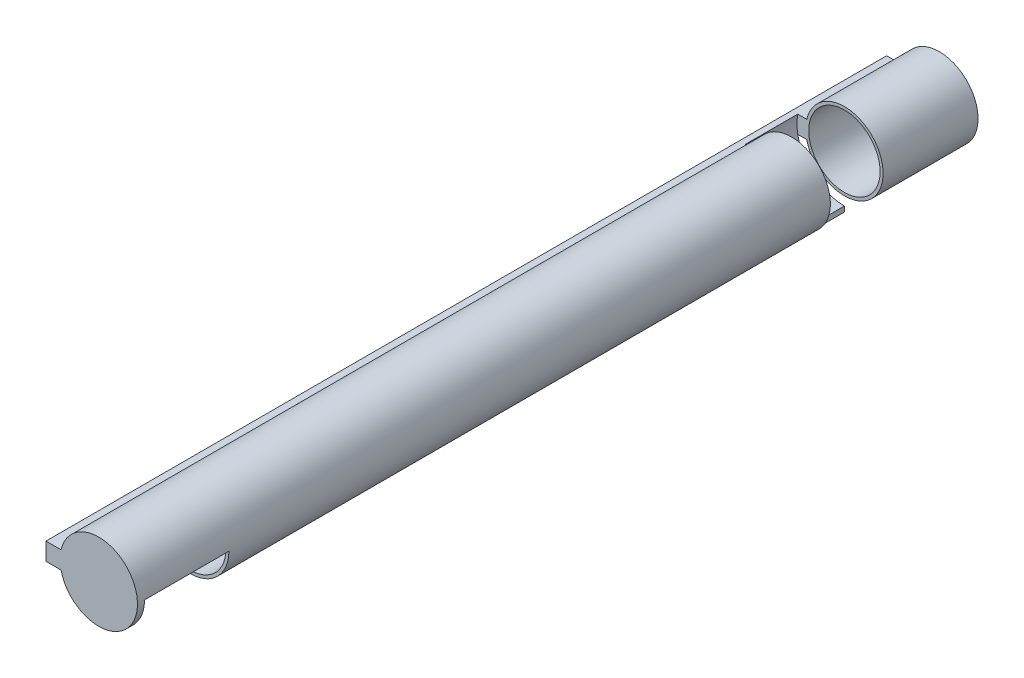
ISO-10303-21;
HEADER;
FILE_DESCRIPTION(('STEP AP214'),'2;1');
FILE_NAME('part.step','',(''),(''),'','','');
FILE_SCHEMA(('AUTOMOTIVE_DESIGN { 1 0 10303 214 1 1 1 1 }'));
ENDSEC;
DATA;
#1=APPLICATION_CONTEXT('core data for automotive mechanical design processes');
#2=APPLICATION_PROTOCOL_DEFINITION('international standard','automotive_design',2000,#1);
#3=PRODUCT_CONTEXT('',#1,'mechanical');
#4=PRODUCT('Part','Part','',(#3));
#5=PRODUCT_RELATED_PRODUCT_CATEGORY('part','',(#4));
#6=PRODUCT_DEFINITION_FORMATION('','',#4);
#7=PRODUCT_DEFINITION_CONTEXT('part definition',#1,'design');
#8=PRODUCT_DEFINITION('design','',#6,#7);
#9=PRODUCT_DEFINITION_SHAPE('','',#8);
#10=(LENGTH_UNIT() NAMED_UNIT(*) SI_UNIT(.MILLI.,.METRE.));
#11=(NAMED_UNIT(*) PLANE_ANGLE_UNIT() SI_UNIT($,.RADIAN.));
#12=(NAMED_UNIT(*) SI_UNIT($,.STERADIAN.) SOLID_ANGLE_UNIT());
#13=UNCERTAINTY_MEASURE_WITH_UNIT(LENGTH_MEASURE(1.E-05),#10,'distance_accuracy_value','');
#14=(GEOMETRIC_REPRESENTATION_CONTEXT(3) GLOBAL_UNCERTAINTY_ASSIGNED_CONTEXT((#13)) GLOBAL_UNIT_ASSIGNED_CONTEXT((#10,
#11,#12)) REPRESENTATION_CONTEXT('',''));
#15=CARTESIAN_POINT('',(0.,0.,0.));
#16=DIRECTION('',(0.,0.,1.));
#17=DIRECTION('',(1.,0.,0.));
#18=AXIS2_PLACEMENT_3D('',#15,#16,#17);
#19=CARTESIAN_POINT('',(0.,0.,213.));
#20=DIRECTION('',(0.,0.,1.));
#21=DIRECTION('',(1.,0.,0.));
#22=AXIS2_PLACEMENT_3D('',#19,#20,#21);
#23=PLANE('',#22);
#24=CARTESIAN_POINT('',(0.,0.,213.));
#25=DIRECTION('',(0.,0.,1.));
#26=DIRECTION('',(1.,0.,0.));
#27=AXIS2_PLACEMENT_3D('',#24,#25,#26);
#28=CIRCLE('',#27,10.15);
#29=CARTESIAN_POINT('',(10.15,0.,213.));
#30=VERTEX_POINT('',#29);
#31=CARTESIAN_POINT('',(0.,-10.15,213.));
#32=VERTEX_POINT('',#31);
#33=EDGE_CURVE('E162',#30,#32,#28,.T.);
#34=ORIENTED_EDGE('',*,*,#33,.T.);
#35=CARTESIAN_POINT('',(-7.71138852474491,-12.2794334975369,213.));
#36=DIRECTION('',(0.,0.,1.));
#37=DIRECTION('',(1.,0.,0.));
#38=AXIS2_PLACEMENT_3D('',#35,#36,#37);
#39=CIRCLE('',#38,8.);
#40=CARTESIAN_POINT('',(-3.45682933867876,-5.50457363682691,213.));
#41=VERTEX_POINT('',#40);
#42=EDGE_CURVE('E168',#32,#41,#39,.T.);
#43=ORIENTED_EDGE('',*,*,#42,.T.);
#44=CARTESIAN_POINT('',(0.,0.,213.));
#45=DIRECTION('',(0.,0.,1.));
#46=DIRECTION('',(1.,0.,0.));
#47=AXIS2_PLACEMENT_3D('',#44,#45,#46);
#48=CIRCLE('',#47,6.5);
#49=CARTESIAN_POINT('',(5.50457363682691,3.45682933867876,213.));
#50=VERTEX_POINT('',#49);
#51=EDGE_CURVE('E164',#50,#41,#48,.T.);
#52=ORIENTED_EDGE('',*,*,#51,.F.);
#53=CARTESIAN_POINT('',(12.2794334975369,7.71138852474491,213.));
#54=DIRECTION('',(0.,0.,1.));
#55=DIRECTION('',(1.,0.,0.));
#56=AXIS2_PLACEMENT_3D('',#53,#54,#55);
#57=CIRCLE('',#56,8.);
#58=EDGE_CURVE('E159',#50,#30,#57,.T.);
#59=ORIENTED_EDGE('',*,*,#58,.T.);
#60=EDGE_LOOP('',(#34,#43,#52,#59));
#61=FACE_BOUND('',#60,.T.);
#62=ADVANCED_FACE('F34',(#61),#23,.T.);
#63=CARTESIAN_POINT('',(0.,0.,210.));
#64=DIRECTION('',(0.,0.,-1.));
#65=DIRECTION('',(-1.,0.,0.));
#66=AXIS2_PLACEMENT_3D('',#63,#64,#65);
#67=CYLINDRICAL_SURFACE('',#66,11.);
#68=CARTESIAN_POINT('',(0.,0.,27.));
#69=DIRECTION('',(0.,0.,1.));
#70=DIRECTION('',(1.,0.,0.));
#71=AXIS2_PLACEMENT_3D('',#68,#69,#70);
#72=CIRCLE('',#71,11.);
#73=CARTESIAN_POINT('',(-10.7121426428143,-2.5,27.));
#74=VERTEX_POINT('',#73);
#75=CARTESIAN_POINT('',(-10.7121426428143,2.5,27.));
#76=VERTEX_POINT('',#75);
#77=EDGE_CURVE('E242',#74,#76,#72,.T.);
#78=ORIENTED_EDGE('',*,*,#77,.F.);
#79=DIRECTION('',(0.,0.,-1.));
#80=VECTOR('',#79,1.);
#81=CARTESIAN_POINT('',(-10.7121426428143,-2.5,245.58678379147));
#82=LINE('',#81,#80);
#83=CARTESIAN_POINT('',(-10.7121426428143,-2.5,0.));
#84=VERTEX_POINT('',#83);
#85=EDGE_CURVE('E265',#74,#84,#82,.T.);
#86=ORIENTED_EDGE('',*,*,#85,.T.);
#87=CARTESIAN_POINT('',(0.,0.,0.));
#88=DIRECTION('',(0.,0.,1.));
#89=DIRECTION('',(1.,0.,0.));
#90=AXIS2_PLACEMENT_3D('',#87,#88,#89);
#91=CIRCLE('',#90,11.);
#92=CARTESIAN_POINT('',(-10.7121426428143,2.5,0.));
#93=VERTEX_POINT('',#92);
#94=EDGE_CURVE('E193',#84,#93,#91,.T.);
#95=ORIENTED_EDGE('',*,*,#94,.T.);
#96=DIRECTION('',(0.,0.,-1.));
#97=VECTOR('',#96,1.);
#98=CARTESIAN_POINT('',(-10.7121426428143,2.5,245.58678379147));
#99=LINE('',#98,#97);
#100=EDGE_CURVE('E261',#76,#93,#99,.T.);
#101=ORIENTED_EDGE('',*,*,#100,.F.);
#102=EDGE_LOOP('',(#78,#86,#95,#101));
#103=FACE_BOUND('',#102,.T.);
#104=ADVANCED_FACE('F344',(#103),#67,.T.);
#105=CARTESIAN_POINT('',(0.,0.,210.));
#106=DIRECTION('',(0.,0.,-1.));
#107=DIRECTION('',(-1.,0.,0.));
#108=AXIS2_PLACEMENT_3D('',#105,#106,#107);
#109=CYLINDRICAL_SURFACE('',#108,10.15);
#110=CARTESIAN_POINT('',(0.,0.,0.));
#111=DIRECTION('',(0.,0.,1.));
#112=DIRECTION('',(1.,0.,0.));
#113=AXIS2_PLACEMENT_3D('',#110,#111,#112);
#114=CIRCLE('',#113,10.15);
#115=CARTESIAN_POINT('',(10.15,0.,0.));
#116=VERTEX_POINT('',#115);
#117=EDGE_CURVE('E312',#116,#116,#114,.T.);
#118=ORIENTED_EDGE('',*,*,#117,.F.);
#119=EDGE_LOOP('',(#118));
#120=FACE_BOUND('',#119,.T.);
#121=CARTESIAN_POINT('',(0.,0.,27.));
#122=DIRECTION('',(0.,0.,1.));
#123=DIRECTION('',(1.,0.,0.));
#124=AXIS2_PLACEMENT_3D('',#121,#122,#123);
#125=CIRCLE('',#124,10.15);
#126=CARTESIAN_POINT('',(10.15,0.,27.));
#127=VERTEX_POINT('',#126);
#128=EDGE_CURVE('E247',#127,#127,#125,.T.);
#129=ORIENTED_EDGE('',*,*,#128,.T.);
#130=EDGE_LOOP('',(#129));
#131=FACE_BOUND('',#130,.T.);
#132=ADVANCED_FACE('F349',(#120,#131),#109,.F.);
#133=DIRECTION('',(0.,0.,-1.));
#134=VECTOR('',#133,1.);
#135=CARTESIAN_POINT('',(11.,0.,237.));
#136=LINE('',#135,#134);
#137=CARTESIAN_POINT('',(11.,0.,237.));
#138=VERTEX_POINT('',#137);
#139=CARTESIAN_POINT('',(11.,0.,213.));
#140=VERTEX_POINT('',#139);
#141=EDGE_CURVE('E208',#138,#140,#136,.T.);
#142=ORIENTED_EDGE('',*,*,#141,.T.);
#143=CARTESIAN_POINT('',(0.,0.,213.));
#144=DIRECTION('',(0.,0.,1.));
#145=DIRECTION('',(1.,0.,0.));
#146=AXIS2_PLACEMENT_3D('',#143,#144,#145);
#147=CIRCLE('',#146,11.);
#148=CARTESIAN_POINT('',(0.,-11.,213.));
#149=VERTEX_POINT('',#148);
#150=EDGE_CURVE('E188',#149,#140,#147,.T.);
#151=ORIENTED_EDGE('',*,*,#150,.F.);
#152=DIRECTION('',(0.,0.,-1.));
#153=VECTOR('',#152,1.);
#154=CARTESIAN_POINT('',(0.,-11.,237.));
#155=LINE('',#154,#153);
#156=CARTESIAN_POINT('',(0.,-11.,237.));
#157=VERTEX_POINT('',#156);
#158=EDGE_CURVE('E309',#157,#149,#155,.T.);
#159=ORIENTED_EDGE('',*,*,#158,.F.);
#160=CARTESIAN_POINT('',(0.,0.,237.));
#161=DIRECTION('',(0.,0.,1.));
#162=DIRECTION('',(1.,0.,0.));
#163=AXIS2_PLACEMENT_3D('',#160,#161,#162);
#164=CIRCLE('',#163,11.);
#165=EDGE_CURVE('E277',#157,#138,#164,.T.);
#166=ORIENTED_EDGE('',*,*,#165,.T.);
#167=EDGE_LOOP('',(#142,#151,#159,#166));
#168=FACE_BOUND('',#167,.T.);
#169=CARTESIAN_POINT('',(-10.7121426428143,-2.5,239.));
#170=VERTEX_POINT('',#169);
#171=CARTESIAN_POINT('',(-10.7121426428143,-2.5,42.));
#172=VERTEX_POINT('',#171);
#173=EDGE_CURVE('E284',#170,#172,#82,.T.);
#174=ORIENTED_EDGE('',*,*,#173,.T.);
#175=CARTESIAN_POINT('',(0.,0.,42.));
#176=DIRECTION('',(0.,0.,1.));
#177=DIRECTION('',(1.,0.,0.));
#178=AXIS2_PLACEMENT_3D('',#175,#176,#177);
#179=CIRCLE('',#178,11.);
#180=CARTESIAN_POINT('',(-10.7121426428143,2.5,42.));
#181=VERTEX_POINT('',#180);
#182=EDGE_CURVE('E250',#172,#181,#179,.T.);
#183=ORIENTED_EDGE('',*,*,#182,.T.);
#184=CARTESIAN_POINT('',(-10.7121426428143,2.5,239.));
#185=VERTEX_POINT('',#184);
#186=EDGE_CURVE('E274',#185,#181,#99,.T.);
#187=ORIENTED_EDGE('',*,*,#186,.F.);
#188=CARTESIAN_POINT('',(0.,0.,239.));
#189=DIRECTION('',(0.,0.,1.));
#190=DIRECTION('',(1.,0.,0.));
#191=AXIS2_PLACEMENT_3D('',#188,#189,#190);
#192=CIRCLE('',#191,11.);
#193=EDGE_CURVE('E291',#170,#185,#192,.T.);
#194=ORIENTED_EDGE('',*,*,#193,.F.);
#195=EDGE_LOOP('',(#174,#183,#187,#194));
#196=FACE_BOUND('',#195,.T.);
#197=ADVANCED_FACE('F351',(#168,#196),#67,.T.);
#198=CARTESIAN_POINT('',(0.,0.,42.));
#199=DIRECTION('',(0.,0.,1.));
#200=DIRECTION('',(1.,0.,0.));
#201=AXIS2_PLACEMENT_3D('',#198,#199,#200);
#202=CIRCLE('',#201,10.15);
#203=CARTESIAN_POINT('',(10.15,0.,42.));
#204=VERTEX_POINT('',#203);
#205=EDGE_CURVE('E256',#204,#204,#202,.T.);
#206=ORIENTED_EDGE('',*,*,#205,.F.);
#207=EDGE_LOOP('',(#206));
#208=FACE_BOUND('',#207,.T.);
#209=CARTESIAN_POINT('',(0.,0.,210.));
#210=DIRECTION('',(0.,0.,1.));
#211=DIRECTION('',(1.,0.,0.));
#212=AXIS2_PLACEMENT_3D('',#209,#210,#211);
#213=CIRCLE('',#212,10.15);
#214=CARTESIAN_POINT('',(10.15,0.,210.));
#215=VERTEX_POINT('',#214);
#216=CARTESIAN_POINT('',(0.,-10.15,210.));
#217=VERTEX_POINT('',#216);
#218=EDGE_CURVE('E313',#215,#217,#213,.T.);
#219=ORIENTED_EDGE('',*,*,#218,.T.);
#220=DIRECTION('',(0.,0.,-1.));
#221=VECTOR('',#220,1.);
#222=CARTESIAN_POINT('',(0.,-10.15,227.354267658087));
#223=LINE('',#222,#221);
#224=EDGE_CURVE('E181',#32,#217,#223,.T.);
#225=ORIENTED_EDGE('',*,*,#224,.F.);
#226=CARTESIAN_POINT('',(0.,0.,213.));
#227=DIRECTION('',(0.,0.,1.));
#228=DIRECTION('',(1.,0.,0.));
#229=AXIS2_PLACEMENT_3D('',#226,#227,#228);
#230=CIRCLE('',#229,10.15);
#231=EDGE_CURVE('E175',#30,#32,#230,.F.);
#232=ORIENTED_EDGE('',*,*,#231,.F.);
#233=DIRECTION('',(0.,0.,-1.));
#234=VECTOR('',#233,1.);
#235=CARTESIAN_POINT('',(10.15,0.,227.354267658087));
#236=LINE('',#235,#234);
#237=EDGE_CURVE('E179',#30,#215,#236,.T.);
#238=ORIENTED_EDGE('',*,*,#237,.T.);
#239=EDGE_LOOP('',(#219,#225,#232,#238));
#240=FACE_BOUND('',#239,.T.);
#241=ADVANCED_FACE('F178',(#208,#240),#109,.F.);
#242=CARTESIAN_POINT('',(0.,0.,0.));
#243=DIRECTION('',(0.,0.,1.));
#244=DIRECTION('',(1.,0.,0.));
#245=AXIS2_PLACEMENT_3D('',#242,#243,#244);
#246=PLANE('',#245);
#247=DIRECTION('',(-1.,0.,0.));
#248=VECTOR('',#247,1.);
#249=CARTESIAN_POINT('',(-11.,2.5,0.));
#250=LINE('',#249,#248);
#251=CARTESIAN_POINT('',(-15.,2.5,0.));
#252=VERTEX_POINT('',#251);
#253=EDGE_CURVE('E271',#93,#252,#250,.T.);
#254=ORIENTED_EDGE('',*,*,#253,.F.);
#255=ORIENTED_EDGE('',*,*,#94,.F.);
#256=DIRECTION('',(1.,0.,0.));
#257=VECTOR('',#256,1.);
#258=CARTESIAN_POINT('',(-11.,-2.5,0.));
#259=LINE('',#258,#257);
#260=CARTESIAN_POINT('',(-15.,-2.5,0.));
#261=VERTEX_POINT('',#260);
#262=EDGE_CURVE('E262',#261,#84,#259,.T.);
#263=ORIENTED_EDGE('',*,*,#262,.F.);
#264=DIRECTION('',(0.,-1.,0.));
#265=VECTOR('',#264,1.);
#266=CARTESIAN_POINT('',(-15.,2.5,0.));
#267=LINE('',#266,#265);
#268=EDGE_CURVE('E267',#252,#261,#267,.T.);
#269=ORIENTED_EDGE('',*,*,#268,.F.);
#270=EDGE_LOOP('',(#254,#255,#263,#269));
#271=FACE_BOUND('',#270,.T.);
#272=ORIENTED_EDGE('',*,*,#117,.T.);
#273=EDGE_LOOP('',(#272));
#274=FACE_BOUND('',#273,.T.);
#275=ADVANCED_FACE('F369',(#271,#274),#246,.F.);
#276=ORIENTED_EDGE('',*,*,#33,.F.);
#277=DIRECTION('',(0.,0.,-1.));
#278=VECTOR('',#277,1.);
#279=CARTESIAN_POINT('',(10.15,0.,237.));
#280=LINE('',#279,#278);
#281=CARTESIAN_POINT('',(10.15,0.,237.));
#282=VERTEX_POINT('',#281);
#283=EDGE_CURVE('E199',#282,#30,#280,.T.);
#284=ORIENTED_EDGE('',*,*,#283,.F.);
#285=CARTESIAN_POINT('',(0.,0.,237.));
#286=DIRECTION('',(0.,0.,-1.));
#287=DIRECTION('',(-1.,0.,0.));
#288=AXIS2_PLACEMENT_3D('',#285,#286,#287);
#289=CIRCLE('',#288,10.15);
#290=CARTESIAN_POINT('',(0.,-10.15,237.));
#291=VERTEX_POINT('',#290);
#292=EDGE_CURVE('E304',#291,#282,#289,.T.);
#293=ORIENTED_EDGE('',*,*,#292,.F.);
#294=DIRECTION('',(0.,0.,-1.));
#295=VECTOR('',#294,1.);
#296=CARTESIAN_POINT('',(0.,-10.15,237.));
#297=LINE('',#296,#295);
#298=EDGE_CURVE('E201',#291,#32,#297,.T.);
#299=ORIENTED_EDGE('',*,*,#298,.T.);
#300=EDGE_LOOP('',(#276,#284,#293,#299));
#301=FACE_BOUND('',#300,.T.);
#302=ADVANCED_FACE('F197',(#301),#109,.F.);
#303=CARTESIAN_POINT('',(0.,-10.15,237.));
#304=DIRECTION('',(-1.,0.,0.));
#305=DIRECTION('',(0.,-1.,0.));
#306=AXIS2_PLACEMENT_3D('',#303,#304,#305);
#307=PLANE('',#306);
#308=ORIENTED_EDGE('',*,*,#158,.T.);
#309=DIRECTION('',(0.,1.,0.));
#310=VECTOR('',#309,1.);
#311=CARTESIAN_POINT('',(0.,-10.15,213.));
#312=LINE('',#311,#310);
#313=EDGE_CURVE('E202',#149,#32,#312,.T.);
#314=ORIENTED_EDGE('',*,*,#313,.T.);
#315=ORIENTED_EDGE('',*,*,#298,.F.);
#316=DIRECTION('',(0.,1.,0.));
#317=VECTOR('',#316,1.);
#318=CARTESIAN_POINT('',(0.,-10.15,237.));
#319=LINE('',#318,#317);
#320=EDGE_CURVE('E301',#157,#291,#319,.T.);
#321=ORIENTED_EDGE('',*,*,#320,.F.);
#322=EDGE_LOOP('',(#308,#314,#315,#321));
#323=FACE_BOUND('',#322,.T.);
#324=ADVANCED_FACE('F359',(#323),#307,.F.);
#325=CARTESIAN_POINT('',(10.15,0.,237.));
#326=DIRECTION('',(0.,1.,0.));
#327=DIRECTION('',(0.,0.,1.));
#328=AXIS2_PLACEMENT_3D('',#325,#326,#327);
#329=PLANE('',#328);
#330=ORIENTED_EDGE('',*,*,#283,.T.);
#331=DIRECTION('',(1.,0.,0.));
#332=VECTOR('',#331,1.);
#333=CARTESIAN_POINT('',(10.15,0.,213.));
#334=LINE('',#333,#332);
#335=EDGE_CURVE('E185',#30,#140,#334,.T.);
#336=ORIENTED_EDGE('',*,*,#335,.T.);
#337=ORIENTED_EDGE('',*,*,#141,.F.);
#338=DIRECTION('',(1.,0.,0.));
#339=VECTOR('',#338,1.);
#340=CARTESIAN_POINT('',(10.15,0.,237.));
#341=LINE('',#340,#339);
#342=EDGE_CURVE('E206',#282,#138,#341,.T.);
#343=ORIENTED_EDGE('',*,*,#342,.F.);
#344=EDGE_LOOP('',(#330,#336,#337,#343));
#345=FACE_BOUND('',#344,.T.);
#346=ADVANCED_FACE('F204',(#345),#329,.F.);
#347=ORIENTED_EDGE('',*,*,#231,.T.);
#348=ORIENTED_EDGE('',*,*,#313,.F.);
#349=ORIENTED_EDGE('',*,*,#150,.T.);
#350=ORIENTED_EDGE('',*,*,#335,.F.);
#351=EDGE_LOOP('',(#347,#348,#349,#350));
#352=FACE_BOUND('',#351,.T.);
#353=ADVANCED_FACE('F186',(#352),#23,.T.);
#354=CARTESIAN_POINT('',(0.,0.,210.));
#355=DIRECTION('',(0.,0.,1.));
#356=DIRECTION('',(1.,0.,0.));
#357=AXIS2_PLACEMENT_3D('',#354,#355,#356);
#358=PLANE('',#357);
#359=CARTESIAN_POINT('',(0.,0.,210.));
#360=DIRECTION('',(0.,0.,1.));
#361=DIRECTION('',(1.,0.,0.));
#362=AXIS2_PLACEMENT_3D('',#359,#360,#361);
#363=CIRCLE('',#362,6.5);
#364=CARTESIAN_POINT('',(5.50457363682691,3.45682933867876,210.));
#365=VERTEX_POINT('',#364);
#366=CARTESIAN_POINT('',(-3.45682933867876,-5.50457363682691,210.));
#367=VERTEX_POINT('',#366);
#368=EDGE_CURVE('E294',#365,#367,#363,.T.);
#369=ORIENTED_EDGE('',*,*,#368,.T.);
#370=CARTESIAN_POINT('',(-7.71138852474491,-12.2794334975369,210.));
#371=DIRECTION('',(0.,0.,1.));
#372=DIRECTION('',(1.,0.,0.));
#373=AXIS2_PLACEMENT_3D('',#370,#371,#372);
#374=CIRCLE('',#373,8.);
#375=EDGE_CURVE('E11',#367,#217,#374,.F.);
#376=ORIENTED_EDGE('',*,*,#375,.T.);
#377=ORIENTED_EDGE('',*,*,#218,.F.);
#378=CARTESIAN_POINT('',(12.2794334975369,7.71138852474491,210.));
#379=DIRECTION('',(0.,0.,1.));
#380=DIRECTION('',(1.,0.,0.));
#381=AXIS2_PLACEMENT_3D('',#378,#379,#380);
#382=CIRCLE('',#381,8.);
#383=EDGE_CURVE('E42',#215,#365,#382,.F.);
#384=ORIENTED_EDGE('',*,*,#383,.T.);
#385=EDGE_LOOP('',(#369,#376,#377,#384));
#386=FACE_BOUND('',#385,.T.);
#387=ADVANCED_FACE('F330',(#386),#358,.F.);
#388=CARTESIAN_POINT('',(0.,0.,213.));
#389=DIRECTION('',(0.,0.,-1.));
#390=DIRECTION('',(-1.,0.,0.));
#391=AXIS2_PLACEMENT_3D('',#388,#389,#390);
#392=CYLINDRICAL_SURFACE('',#391,6.5);
#393=ORIENTED_EDGE('',*,*,#51,.T.);
#394=DIRECTION('',(0.,0.,-1.));
#395=VECTOR('',#394,1.);
#396=CARTESIAN_POINT('',(-3.45682933867876,-5.50457363682691,213.));
#397=LINE('',#396,#395);
#398=EDGE_CURVE('E49',#41,#367,#397,.T.);
#399=ORIENTED_EDGE('',*,*,#398,.T.);
#400=ORIENTED_EDGE('',*,*,#368,.F.);
#401=DIRECTION('',(0.,0.,-1.));
#402=VECTOR('',#401,1.);
#403=CARTESIAN_POINT('',(5.50457363682691,3.45682933867876,213.));
#404=LINE('',#403,#402);
#405=EDGE_CURVE('E326',#365,#50,#404,.F.);
#406=ORIENTED_EDGE('',*,*,#405,.T.);
#407=EDGE_LOOP('',(#393,#399,#400,#406));
#408=FACE_BOUND('',#407,.T.);
#409=ADVANCED_FACE('F328',(#408),#392,.F.);
#410=CARTESIAN_POINT('',(0.,0.,237.));
#411=DIRECTION('',(0.,0.,1.));
#412=DIRECTION('',(1.,0.,0.));
#413=AXIS2_PLACEMENT_3D('',#410,#411,#412);
#414=PLANE('',#413);
#415=ORIENTED_EDGE('',*,*,#165,.F.);
#416=ORIENTED_EDGE('',*,*,#320,.T.);
#417=ORIENTED_EDGE('',*,*,#292,.T.);
#418=ORIENTED_EDGE('',*,*,#342,.T.);
#419=EDGE_LOOP('',(#415,#416,#417,#418));
#420=FACE_BOUND('',#419,.T.);
#421=ADVANCED_FACE('F446',(#420),#414,.F.);
#422=CARTESIAN_POINT('',(0.,0.,239.));
#423=DIRECTION('',(0.,0.,1.));
#424=DIRECTION('',(1.,0.,0.));
#425=AXIS2_PLACEMENT_3D('',#422,#423,#424);
#426=PLANE('',#425);
#427=ORIENTED_EDGE('',*,*,#193,.T.);
#428=DIRECTION('',(-1.,0.,0.));
#429=VECTOR('',#428,1.);
#430=CARTESIAN_POINT('',(-11.,2.5,239.));
#431=LINE('',#430,#429);
#432=CARTESIAN_POINT('',(-15.,2.5,239.));
#433=VERTEX_POINT('',#432);
#434=EDGE_CURVE('E281',#185,#433,#431,.T.);
#435=ORIENTED_EDGE('',*,*,#434,.T.);
#436=DIRECTION('',(0.,-1.,0.));
#437=VECTOR('',#436,1.);
#438=CARTESIAN_POINT('',(-15.,2.5,239.));
#439=LINE('',#438,#437);
#440=CARTESIAN_POINT('',(-15.,-2.5,239.));
#441=VERTEX_POINT('',#440);
#442=EDGE_CURVE('E278',#433,#441,#439,.T.);
#443=ORIENTED_EDGE('',*,*,#442,.T.);
#444=DIRECTION('',(1.,0.,0.));
#445=VECTOR('',#444,1.);
#446=CARTESIAN_POINT('',(-11.,-2.5,239.));
#447=LINE('',#446,#445);
#448=EDGE_CURVE('E275',#441,#170,#447,.T.);
#449=ORIENTED_EDGE('',*,*,#448,.T.);
#450=EDGE_LOOP('',(#427,#435,#443,#449));
#451=FACE_BOUND('',#450,.T.);
#452=ADVANCED_FACE('F409',(#451),#426,.T.);
#453=CARTESIAN_POINT('',(-11.,2.5,245.58678379147));
#454=DIRECTION('',(0.,-1.,0.));
#455=DIRECTION('',(0.,0.,-1.));
#456=AXIS2_PLACEMENT_3D('',#453,#454,#455);
#457=PLANE('',#456);
#458=ORIENTED_EDGE('',*,*,#186,.T.);
#459=DIRECTION('',(-1.,0.,0.));
#460=VECTOR('',#459,1.);
#461=CARTESIAN_POINT('',(-11.,2.5,42.));
#462=LINE('',#461,#460);
#463=CARTESIAN_POINT('',(-13.2664991614216,2.5,42.));
#464=VERTEX_POINT('',#463);
#465=EDGE_CURVE('E253',#181,#464,#462,.T.);
#466=ORIENTED_EDGE('',*,*,#465,.T.);
#467=DIRECTION('',(0.,0.,-1.));
#468=VECTOR('',#467,1.);
#469=CARTESIAN_POINT('',(-13.2664991614216,2.5,42.));
#470=LINE('',#469,#468);
#471=CARTESIAN_POINT('',(-13.2664991614216,2.5,27.));
#472=VERTEX_POINT('',#471);
#473=EDGE_CURVE('E259',#472,#464,#470,.F.);
#474=ORIENTED_EDGE('',*,*,#473,.F.);
#475=DIRECTION('',(-1.,0.,0.));
#476=VECTOR('',#475,1.);
#477=CARTESIAN_POINT('',(-11.,2.5,27.));
#478=LINE('',#477,#476);
#479=EDGE_CURVE('E245',#76,#472,#478,.T.);
#480=ORIENTED_EDGE('',*,*,#479,.F.);
#481=ORIENTED_EDGE('',*,*,#100,.T.);
#482=ORIENTED_EDGE('',*,*,#253,.T.);
#483=DIRECTION('',(0.,0.,-1.));
#484=VECTOR('',#483,1.);
#485=CARTESIAN_POINT('',(-15.,2.5,245.58678379147));
#486=LINE('',#485,#484);
#487=EDGE_CURVE('E270',#433,#252,#486,.T.);
#488=ORIENTED_EDGE('',*,*,#487,.F.);
#489=ORIENTED_EDGE('',*,*,#434,.F.);
#490=EDGE_LOOP('',(#458,#466,#474,#480,#481,#482,#488,#489));
#491=FACE_BOUND('',#490,.T.);
#492=ADVANCED_FACE('F405',(#491),#457,.F.);
#493=CARTESIAN_POINT('',(-15.,2.5,245.58678379147));
#494=DIRECTION('',(1.,0.,0.));
#495=DIRECTION('',(0.,0.,-1.));
#496=AXIS2_PLACEMENT_3D('',#493,#494,#495);
#497=PLANE('',#496);
#498=ORIENTED_EDGE('',*,*,#442,.F.);
#499=ORIENTED_EDGE('',*,*,#487,.T.);
#500=ORIENTED_EDGE('',*,*,#268,.T.);
#501=DIRECTION('',(0.,0.,-1.));
#502=VECTOR('',#501,1.);
#503=CARTESIAN_POINT('',(-15.,-2.5,245.58678379147));
#504=LINE('',#503,#502);
#505=EDGE_CURVE('E266',#441,#261,#504,.T.);
#506=ORIENTED_EDGE('',*,*,#505,.F.);
#507=EDGE_LOOP('',(#498,#499,#500,#506));
#508=FACE_BOUND('',#507,.T.);
#509=ADVANCED_FACE('F411',(#508),#497,.F.);
#510=CARTESIAN_POINT('',(-11.,-2.5,245.58678379147));
#511=DIRECTION('',(0.,1.,0.));
#512=DIRECTION('',(0.,0.,1.));
#513=AXIS2_PLACEMENT_3D('',#510,#511,#512);
#514=PLANE('',#513);
#515=DIRECTION('',(0.,0.,-1.));
#516=VECTOR('',#515,1.);
#517=CARTESIAN_POINT('',(-14.790199457749,-2.5,42.));
#518=LINE('',#517,#516);
#519=CARTESIAN_POINT('',(-14.790199457749,-2.5,42.));
#520=VERTEX_POINT('',#519);
#521=CARTESIAN_POINT('',(-14.790199457749,-2.5,27.));
#522=VERTEX_POINT('',#521);
#523=EDGE_CURVE('E169',#520,#522,#518,.T.);
#524=ORIENTED_EDGE('',*,*,#523,.F.);
#525=DIRECTION('',(1.,0.,0.));
#526=VECTOR('',#525,1.);
#527=CARTESIAN_POINT('',(-11.,-2.5,42.));
#528=LINE('',#527,#526);
#529=CARTESIAN_POINT('',(-13.2664991614216,-2.5,42.));
#530=VERTEX_POINT('',#529);
#531=EDGE_CURVE('E236',#520,#530,#528,.T.);
#532=ORIENTED_EDGE('',*,*,#531,.T.);
#533=DIRECTION('',(1.,0.,0.));
#534=VECTOR('',#533,1.);
#535=CARTESIAN_POINT('',(-11.,-2.5,42.));
#536=LINE('',#535,#534);
#537=EDGE_CURVE('E320',#530,#172,#536,.T.);
#538=ORIENTED_EDGE('',*,*,#537,.T.);
#539=ORIENTED_EDGE('',*,*,#173,.F.);
#540=ORIENTED_EDGE('',*,*,#448,.F.);
#541=ORIENTED_EDGE('',*,*,#505,.T.);
#542=ORIENTED_EDGE('',*,*,#262,.T.);
#543=ORIENTED_EDGE('',*,*,#85,.F.);
#544=DIRECTION('',(1.,0.,0.));
#545=VECTOR('',#544,1.);
#546=CARTESIAN_POINT('',(-11.,-2.5,27.));
#547=LINE('',#546,#545);
#548=CARTESIAN_POINT('',(-13.2664991614216,-2.5,27.));
#549=VERTEX_POINT('',#548);
#550=EDGE_CURVE('E192',#549,#74,#547,.T.);
#551=ORIENTED_EDGE('',*,*,#550,.F.);
#552=DIRECTION('',(1.,0.,0.));
#553=VECTOR('',#552,1.);
#554=CARTESIAN_POINT('',(-11.,-2.5,27.));
#555=LINE('',#554,#553);
#556=EDGE_CURVE('E233',#522,#549,#555,.T.);
#557=ORIENTED_EDGE('',*,*,#556,.F.);
#558=EDGE_LOOP('',(#524,#532,#538,#539,#540,#541,#542,#543,#551,#557));
#559=FACE_BOUND('',#558,.T.);
#560=ADVANCED_FACE('F385',(#559),#514,.F.);
#561=CARTESIAN_POINT('',(0.,0.,42.));
#562=DIRECTION('',(0.,0.,-1.));
#563=DIRECTION('',(-1.,0.,0.));
#564=AXIS2_PLACEMENT_3D('',#561,#562,#563);
#565=CYLINDRICAL_SURFACE('',#564,13.5);
#566=CARTESIAN_POINT('',(0.,0.,27.));
#567=DIRECTION('',(0.,0.,-1.));
#568=DIRECTION('',(1.,0.,0.));
#569=AXIS2_PLACEMENT_3D('',#566,#567,#568);
#570=CIRCLE('',#569,13.5);
#571=CARTESIAN_POINT('',(0.,-13.5,27.));
#572=VERTEX_POINT('',#571);
#573=EDGE_CURVE('E222',#572,#549,#570,.T.);
#574=ORIENTED_EDGE('',*,*,#573,.T.);
#575=CARTESIAN_POINT('',(0.,0.,27.));
#576=DIRECTION('',(0.,0.,1.));
#577=DIRECTION('',(1.,0.,0.));
#578=AXIS2_PLACEMENT_3D('',#575,#576,#577);
#579=CIRCLE('',#578,13.5);
#580=EDGE_CURVE('E239',#472,#549,#579,.T.);
#581=ORIENTED_EDGE('',*,*,#580,.F.);
#582=ORIENTED_EDGE('',*,*,#473,.T.);
#583=CARTESIAN_POINT('',(0.,0.,42.));
#584=DIRECTION('',(0.,0.,1.));
#585=DIRECTION('',(1.,0.,0.));
#586=AXIS2_PLACEMENT_3D('',#583,#584,#585);
#587=CIRCLE('',#586,13.5);
#588=EDGE_CURVE('E240',#464,#530,#587,.T.);
#589=ORIENTED_EDGE('',*,*,#588,.T.);
#590=CARTESIAN_POINT('',(0.,0.,42.));
#591=DIRECTION('',(0.,0.,-1.));
#592=DIRECTION('',(1.,0.,0.));
#593=AXIS2_PLACEMENT_3D('',#590,#591,#592);
#594=CIRCLE('',#593,13.5);
#595=CARTESIAN_POINT('',(0.,-13.5,42.));
#596=VERTEX_POINT('',#595);
#597=EDGE_CURVE('E213',#596,#530,#594,.T.);
#598=ORIENTED_EDGE('',*,*,#597,.F.);
#599=DIRECTION('',(0.,0.,-1.));
#600=VECTOR('',#599,1.);
#601=CARTESIAN_POINT('',(0.,-13.5,42.));
#602=LINE('',#601,#600);
#603=EDGE_CURVE('E221',#596,#572,#602,.T.);
#604=ORIENTED_EDGE('',*,*,#603,.T.);
#605=EDGE_LOOP('',(#574,#581,#582,#589,#598,#604));
#606=FACE_BOUND('',#605,.T.);
#607=ADVANCED_FACE('F399',(#606),#565,.F.);
#608=CARTESIAN_POINT('',(0.,0.,42.));
#609=DIRECTION('',(0.,0.,1.));
#610=DIRECTION('',(1.,0.,0.));
#611=AXIS2_PLACEMENT_3D('',#608,#609,#610);
#612=PLANE('',#611);
#613=ORIENTED_EDGE('',*,*,#205,.T.);
#614=EDGE_LOOP('',(#613));
#615=FACE_BOUND('',#614,.T.);
#616=ORIENTED_EDGE('',*,*,#182,.F.);
#617=ORIENTED_EDGE('',*,*,#537,.F.);
#618=ORIENTED_EDGE('',*,*,#588,.F.);
#619=ORIENTED_EDGE('',*,*,#465,.F.);
#620=EDGE_LOOP('',(#616,#617,#618,#619));
#621=FACE_BOUND('',#620,.T.);
#622=ADVANCED_FACE('F391',(#615,#621),#612,.F.);
#623=CARTESIAN_POINT('',(0.,0.,27.));
#624=DIRECTION('',(0.,0.,1.));
#625=DIRECTION('',(1.,0.,0.));
#626=AXIS2_PLACEMENT_3D('',#623,#624,#625);
#627=PLANE('',#626);
#628=ORIENTED_EDGE('',*,*,#128,.F.);
#629=EDGE_LOOP('',(#628));
#630=FACE_BOUND('',#629,.T.);
#631=ORIENTED_EDGE('',*,*,#479,.T.);
#632=ORIENTED_EDGE('',*,*,#580,.T.);
#633=ORIENTED_EDGE('',*,*,#550,.T.);
#634=ORIENTED_EDGE('',*,*,#77,.T.);
#635=EDGE_LOOP('',(#631,#632,#633,#634));
#636=FACE_BOUND('',#635,.T.);
#637=ADVANCED_FACE('F421',(#630,#636),#627,.T.);
#638=CARTESIAN_POINT('',(0.,0.,42.));
#639=DIRECTION('',(0.,0.,-1.));
#640=DIRECTION('',(-1.,0.,0.));
#641=AXIS2_PLACEMENT_3D('',#638,#639,#640);
#642=CYLINDRICAL_SURFACE('',#641,15.);
#643=CARTESIAN_POINT('',(0.,0.,42.));
#644=DIRECTION('',(0.,0.,1.));
#645=DIRECTION('',(1.,0.,0.));
#646=AXIS2_PLACEMENT_3D('',#643,#644,#645);
#647=CIRCLE('',#646,15.);
#648=CARTESIAN_POINT('',(0.,-15.,42.));
#649=VERTEX_POINT('',#648);
#650=EDGE_CURVE('E216',#520,#649,#647,.T.);
#651=ORIENTED_EDGE('',*,*,#650,.F.);
#652=ORIENTED_EDGE('',*,*,#523,.T.);
#653=CARTESIAN_POINT('',(0.,0.,27.));
#654=DIRECTION('',(0.,0.,1.));
#655=DIRECTION('',(1.,0.,0.));
#656=AXIS2_PLACEMENT_3D('',#653,#654,#655);
#657=CIRCLE('',#656,15.);
#658=CARTESIAN_POINT('',(0.,-15.,27.));
#659=VERTEX_POINT('',#658);
#660=EDGE_CURVE('E225',#522,#659,#657,.T.);
#661=ORIENTED_EDGE('',*,*,#660,.T.);
#662=DIRECTION('',(0.,0.,-1.));
#663=VECTOR('',#662,1.);
#664=CARTESIAN_POINT('',(0.,-15.,42.));
#665=LINE('',#664,#663);
#666=EDGE_CURVE('E230',#649,#659,#665,.T.);
#667=ORIENTED_EDGE('',*,*,#666,.F.);
#668=EDGE_LOOP('',(#651,#652,#661,#667));
#669=FACE_BOUND('',#668,.T.);
#670=ADVANCED_FACE('F423',(#669),#642,.T.);
#671=CARTESIAN_POINT('',(0.,0.,42.));
#672=DIRECTION('',(0.,0.,1.));
#673=DIRECTION('',(1.,0.,0.));
#674=AXIS2_PLACEMENT_3D('',#671,#672,#673);
#675=PLANE('',#674);
#676=ORIENTED_EDGE('',*,*,#531,.F.);
#677=ORIENTED_EDGE('',*,*,#650,.T.);
#678=DIRECTION('',(0.,1.,0.));
#679=VECTOR('',#678,1.);
#680=CARTESIAN_POINT('',(0.,-13.5,42.));
#681=LINE('',#680,#679);
#682=EDGE_CURVE('E219',#649,#596,#681,.T.);
#683=ORIENTED_EDGE('',*,*,#682,.T.);
#684=ORIENTED_EDGE('',*,*,#597,.T.);
#685=EDGE_LOOP('',(#676,#677,#683,#684));
#686=FACE_BOUND('',#685,.T.);
#687=ADVANCED_FACE('F394',(#686),#675,.T.);
#688=CARTESIAN_POINT('',(0.,0.,27.));
#689=DIRECTION('',(0.,0.,1.));
#690=DIRECTION('',(1.,0.,0.));
#691=AXIS2_PLACEMENT_3D('',#688,#689,#690);
#692=PLANE('',#691);
#693=ORIENTED_EDGE('',*,*,#660,.F.);
#694=ORIENTED_EDGE('',*,*,#556,.T.);
#695=ORIENTED_EDGE('',*,*,#573,.F.);
#696=DIRECTION('',(0.,1.,0.));
#697=VECTOR('',#696,1.);
#698=CARTESIAN_POINT('',(0.,-13.5,27.));
#699=LINE('',#698,#697);
#700=EDGE_CURVE('E217',#659,#572,#699,.T.);
#701=ORIENTED_EDGE('',*,*,#700,.F.);
#702=EDGE_LOOP('',(#693,#694,#695,#701));
#703=FACE_BOUND('',#702,.T.);
#704=ADVANCED_FACE('F339',(#703),#692,.F.);
#705=CARTESIAN_POINT('',(0.,-13.5,42.));
#706=DIRECTION('',(-1.,0.,0.));
#707=DIRECTION('',(0.,-1.,0.));
#708=AXIS2_PLACEMENT_3D('',#705,#706,#707);
#709=PLANE('',#708);
#710=ORIENTED_EDGE('',*,*,#700,.T.);
#711=ORIENTED_EDGE('',*,*,#603,.F.);
#712=ORIENTED_EDGE('',*,*,#682,.F.);
#713=ORIENTED_EDGE('',*,*,#666,.T.);
#714=EDGE_LOOP('',(#710,#711,#712,#713));
#715=FACE_BOUND('',#714,.T.);
#716=ADVANCED_FACE('F334',(#715),#709,.F.);
#717=CARTESIAN_POINT('',(-7.71138852474491,-12.2794334975369,213.));
#718=DIRECTION('',(0.,0.,1.));
#719=DIRECTION('',(1.,0.,0.));
#720=AXIS2_PLACEMENT_3D('',#717,#718,#719);
#721=CYLINDRICAL_SURFACE('',#720,8.);
#722=ORIENTED_EDGE('',*,*,#375,.F.);
#723=ORIENTED_EDGE('',*,*,#398,.F.);
#724=ORIENTED_EDGE('',*,*,#42,.F.);
#725=ORIENTED_EDGE('',*,*,#224,.T.);
#726=EDGE_LOOP('',(#722,#723,#724,#725));
#727=FACE_BOUND('',#726,.T.);
#728=ADVANCED_FACE('F332',(#727),#721,.T.);
#729=CARTESIAN_POINT('',(12.2794334975369,7.71138852474491,213.));
#730=DIRECTION('',(0.,0.,-1.));
#731=DIRECTION('',(-1.,0.,0.));
#732=AXIS2_PLACEMENT_3D('',#729,#730,#731);
#733=CYLINDRICAL_SURFACE('',#732,8.);
#734=ORIENTED_EDGE('',*,*,#58,.F.);
#735=ORIENTED_EDGE('',*,*,#405,.F.);
#736=ORIENTED_EDGE('',*,*,#383,.F.);
#737=ORIENTED_EDGE('',*,*,#237,.F.);
#738=EDGE_LOOP('',(#734,#735,#736,#737));
#739=FACE_BOUND('',#738,.T.);
#740=ADVANCED_FACE('F36',(#739),#733,.T.);
#741=CLOSED_SHELL('',(#62,#104,#132,#197,#241,#275,#302,#324,#346,#353,#387,#409,#421,#452,#492,
#509,#560,#607,#622,#637,#670,#687,#704,#716,#728,#740));
#742=MANIFOLD_SOLID_BREP('B2',#741);
#743=ADVANCED_BREP_SHAPE_REPRESENTATION('',(#18,#742),#14);
#744=SHAPE_DEFINITION_REPRESENTATION(#9,#743);
ENDSEC;
END-ISO-10303-21;
